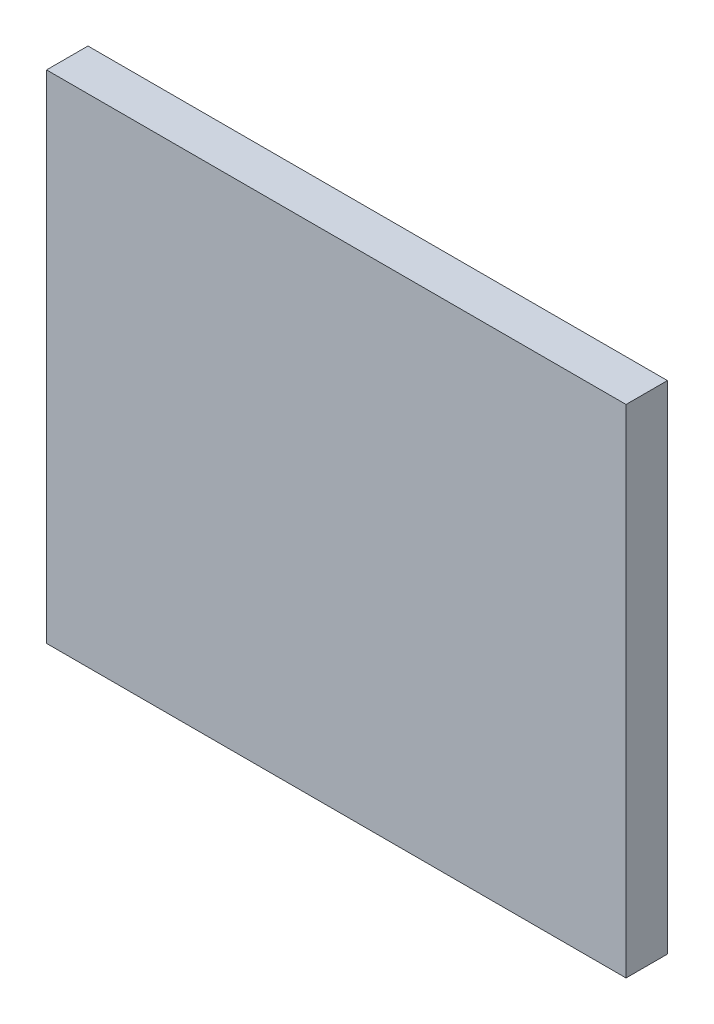
ISO-10303-21;
HEADER;
FILE_DESCRIPTION(('STEP AP214'),'2;1');
FILE_NAME('part.step','',(''),(''),'','','');
FILE_SCHEMA(('AUTOMOTIVE_DESIGN { 1 0 10303 214 1 1 1 1 }'));
ENDSEC;
DATA;
#1=APPLICATION_CONTEXT('core data for automotive mechanical design processes');
#2=APPLICATION_PROTOCOL_DEFINITION('international standard','automotive_design',2000,#1);
#3=PRODUCT_CONTEXT('',#1,'mechanical');
#4=PRODUCT('Part','Part','',(#3));
#5=PRODUCT_RELATED_PRODUCT_CATEGORY('part','',(#4));
#6=PRODUCT_DEFINITION_FORMATION('','',#4);
#7=PRODUCT_DEFINITION_CONTEXT('part definition',#1,'design');
#8=PRODUCT_DEFINITION('design','',#6,#7);
#9=PRODUCT_DEFINITION_SHAPE('','',#8);
#10=(LENGTH_UNIT() NAMED_UNIT(*) SI_UNIT(.MILLI.,.METRE.));
#11=(NAMED_UNIT(*) PLANE_ANGLE_UNIT() SI_UNIT($,.RADIAN.));
#12=(NAMED_UNIT(*) SI_UNIT($,.STERADIAN.) SOLID_ANGLE_UNIT());
#13=UNCERTAINTY_MEASURE_WITH_UNIT(LENGTH_MEASURE(1.E-05),#10,'distance_accuracy_value','');
#14=(GEOMETRIC_REPRESENTATION_CONTEXT(3) GLOBAL_UNCERTAINTY_ASSIGNED_CONTEXT((#13)) GLOBAL_UNIT_ASSIGNED_CONTEXT((#10,
#11,#12)) REPRESENTATION_CONTEXT('',''));
#15=CARTESIAN_POINT('',(0.,0.,0.));
#16=DIRECTION('',(0.,0.,1.));
#17=DIRECTION('',(1.,0.,0.));
#18=AXIS2_PLACEMENT_3D('',#15,#16,#17);
#19=CARTESIAN_POINT('',(0.,0.,6.35));
#20=DIRECTION('',(1.,0.,0.));
#21=DIRECTION('',(0.,0.,-1.));
#22=AXIS2_PLACEMENT_3D('',#19,#20,#21);
#23=PLANE('',#22);
#24=DIRECTION('',(0.,-1.,0.));
#25=VECTOR('',#24,1.);
#26=CARTESIAN_POINT('',(0.,0.,0.));
#27=LINE('',#26,#25);
#28=CARTESIAN_POINT('',(0.,76.2,0.));
#29=VERTEX_POINT('',#28);
#30=CARTESIAN_POINT('',(0.,0.,0.));
#31=VERTEX_POINT('',#30);
#32=EDGE_CURVE('E96',#29,#31,#27,.T.);
#33=ORIENTED_EDGE('',*,*,#32,.T.);
#34=DIRECTION('',(0.,0.,-1.));
#35=VECTOR('',#34,1.);
#36=CARTESIAN_POINT('',(0.,0.,6.35));
#37=LINE('',#36,#35);
#38=CARTESIAN_POINT('',(0.,0.,6.35));
#39=VERTEX_POINT('',#38);
#40=EDGE_CURVE('E11',#39,#31,#37,.T.);
#41=ORIENTED_EDGE('',*,*,#40,.F.);
#42=DIRECTION('',(0.,-1.,0.));
#43=VECTOR('',#42,1.);
#44=CARTESIAN_POINT('',(0.,0.,6.35));
#45=LINE('',#44,#43);
#46=CARTESIAN_POINT('',(0.,76.2,6.35));
#47=VERTEX_POINT('',#46);
#48=EDGE_CURVE('E84',#47,#39,#45,.T.);
#49=ORIENTED_EDGE('',*,*,#48,.F.);
#50=DIRECTION('',(0.,0.,-1.));
#51=VECTOR('',#50,1.);
#52=CARTESIAN_POINT('',(0.,76.2,6.35));
#53=LINE('',#52,#51);
#54=EDGE_CURVE('E92',#47,#29,#53,.T.);
#55=ORIENTED_EDGE('',*,*,#54,.T.);
#56=EDGE_LOOP('',(#33,#41,#49,#55));
#57=FACE_BOUND('',#56,.T.);
#58=ADVANCED_FACE('F33',(#57),#23,.F.);
#59=CARTESIAN_POINT('',(0.,0.,6.35));
#60=DIRECTION('',(0.,1.,0.));
#61=DIRECTION('',(0.,0.,1.));
#62=AXIS2_PLACEMENT_3D('',#59,#60,#61);
#63=PLANE('',#62);
#64=DIRECTION('',(1.,0.,0.));
#65=VECTOR('',#64,1.);
#66=CARTESIAN_POINT('',(0.,0.,0.));
#67=LINE('',#66,#65);
#68=CARTESIAN_POINT('',(88.9,0.,0.));
#69=VERTEX_POINT('',#68);
#70=EDGE_CURVE('E88',#31,#69,#67,.T.);
#71=ORIENTED_EDGE('',*,*,#70,.T.);
#72=DIRECTION('',(0.,0.,-1.));
#73=VECTOR('',#72,1.);
#74=CARTESIAN_POINT('',(88.9,0.,6.35));
#75=LINE('',#74,#73);
#76=CARTESIAN_POINT('',(88.9,0.,6.35));
#77=VERTEX_POINT('',#76);
#78=EDGE_CURVE('E41',#77,#69,#75,.T.);
#79=ORIENTED_EDGE('',*,*,#78,.F.);
#80=DIRECTION('',(1.,0.,0.));
#81=VECTOR('',#80,1.);
#82=CARTESIAN_POINT('',(0.,0.,6.35));
#83=LINE('',#82,#81);
#84=EDGE_CURVE('E79',#39,#77,#83,.T.);
#85=ORIENTED_EDGE('',*,*,#84,.F.);
#86=ORIENTED_EDGE('',*,*,#40,.T.);
#87=EDGE_LOOP('',(#71,#79,#85,#86));
#88=FACE_BOUND('',#87,.T.);
#89=ADVANCED_FACE('F87',(#88),#63,.F.);
#90=CARTESIAN_POINT('',(88.9,0.,6.35));
#91=DIRECTION('',(-1.,0.,0.));
#92=DIRECTION('',(0.,0.,1.));
#93=AXIS2_PLACEMENT_3D('',#90,#91,#92);
#94=PLANE('',#93);
#95=DIRECTION('',(0.,1.,0.));
#96=VECTOR('',#95,1.);
#97=CARTESIAN_POINT('',(88.9,0.,0.));
#98=LINE('',#97,#96);
#99=CARTESIAN_POINT('',(88.9,76.2,0.));
#100=VERTEX_POINT('',#99);
#101=EDGE_CURVE('E66',#69,#100,#98,.T.);
#102=ORIENTED_EDGE('',*,*,#101,.T.);
#103=DIRECTION('',(0.,0.,-1.));
#104=VECTOR('',#103,1.);
#105=CARTESIAN_POINT('',(88.9,76.2,6.35));
#106=LINE('',#105,#104);
#107=CARTESIAN_POINT('',(88.9,76.2,6.35));
#108=VERTEX_POINT('',#107);
#109=EDGE_CURVE('E89',#108,#100,#106,.T.);
#110=ORIENTED_EDGE('',*,*,#109,.F.);
#111=DIRECTION('',(0.,1.,0.));
#112=VECTOR('',#111,1.);
#113=CARTESIAN_POINT('',(88.9,0.,6.35));
#114=LINE('',#113,#112);
#115=EDGE_CURVE('E82',#77,#108,#114,.T.);
#116=ORIENTED_EDGE('',*,*,#115,.F.);
#117=ORIENTED_EDGE('',*,*,#78,.T.);
#118=EDGE_LOOP('',(#102,#110,#116,#117));
#119=FACE_BOUND('',#118,.T.);
#120=ADVANCED_FACE('F90',(#119),#94,.F.);
#121=CARTESIAN_POINT('',(0.,76.2,6.35));
#122=DIRECTION('',(0.,-1.,0.));
#123=DIRECTION('',(0.,0.,-1.));
#124=AXIS2_PLACEMENT_3D('',#121,#122,#123);
#125=PLANE('',#124);
#126=DIRECTION('',(-1.,0.,0.));
#127=VECTOR('',#126,1.);
#128=CARTESIAN_POINT('',(0.,76.2,0.));
#129=LINE('',#128,#127);
#130=EDGE_CURVE('E72',#100,#29,#129,.T.);
#131=ORIENTED_EDGE('',*,*,#130,.T.);
#132=ORIENTED_EDGE('',*,*,#54,.F.);
#133=DIRECTION('',(-1.,0.,0.));
#134=VECTOR('',#133,1.);
#135=CARTESIAN_POINT('',(0.,76.2,6.35));
#136=LINE('',#135,#134);
#137=EDGE_CURVE('E49',#108,#47,#136,.T.);
#138=ORIENTED_EDGE('',*,*,#137,.F.);
#139=ORIENTED_EDGE('',*,*,#109,.T.);
#140=EDGE_LOOP('',(#131,#132,#138,#139));
#141=FACE_BOUND('',#140,.T.);
#142=ADVANCED_FACE('F103',(#141),#125,.F.);
#143=CARTESIAN_POINT('',(0.,0.,6.35));
#144=DIRECTION('',(0.,0.,-1.));
#145=DIRECTION('',(-1.,0.,0.));
#146=AXIS2_PLACEMENT_3D('',#143,#144,#145);
#147=PLANE('',#146);
#148=ORIENTED_EDGE('',*,*,#48,.T.);
#149=ORIENTED_EDGE('',*,*,#84,.T.);
#150=ORIENTED_EDGE('',*,*,#115,.T.);
#151=ORIENTED_EDGE('',*,*,#137,.T.);
#152=EDGE_LOOP('',(#148,#149,#150,#151));
#153=FACE_BOUND('',#152,.T.);
#154=ADVANCED_FACE('F80',(#153),#147,.F.);
#155=CARTESIAN_POINT('',(0.,0.,0.));
#156=DIRECTION('',(0.,0.,-1.));
#157=DIRECTION('',(-1.,0.,0.));
#158=AXIS2_PLACEMENT_3D('',#155,#156,#157);
#159=PLANE('',#158);
#160=ORIENTED_EDGE('',*,*,#32,.F.);
#161=ORIENTED_EDGE('',*,*,#130,.F.);
#162=ORIENTED_EDGE('',*,*,#101,.F.);
#163=ORIENTED_EDGE('',*,*,#70,.F.);
#164=EDGE_LOOP('',(#160,#161,#162,#163));
#165=FACE_BOUND('',#164,.T.);
#166=ADVANCED_FACE('F106',(#165),#159,.T.);
#167=CLOSED_SHELL('',(#58,#89,#120,#142,#154,#166));
#168=MANIFOLD_SOLID_BREP('B2',#167);
#169=ADVANCED_BREP_SHAPE_REPRESENTATION('',(#18,#168),#14);
#170=SHAPE_DEFINITION_REPRESENTATION(#9,#169);
ENDSEC;
END-ISO-10303-21;
